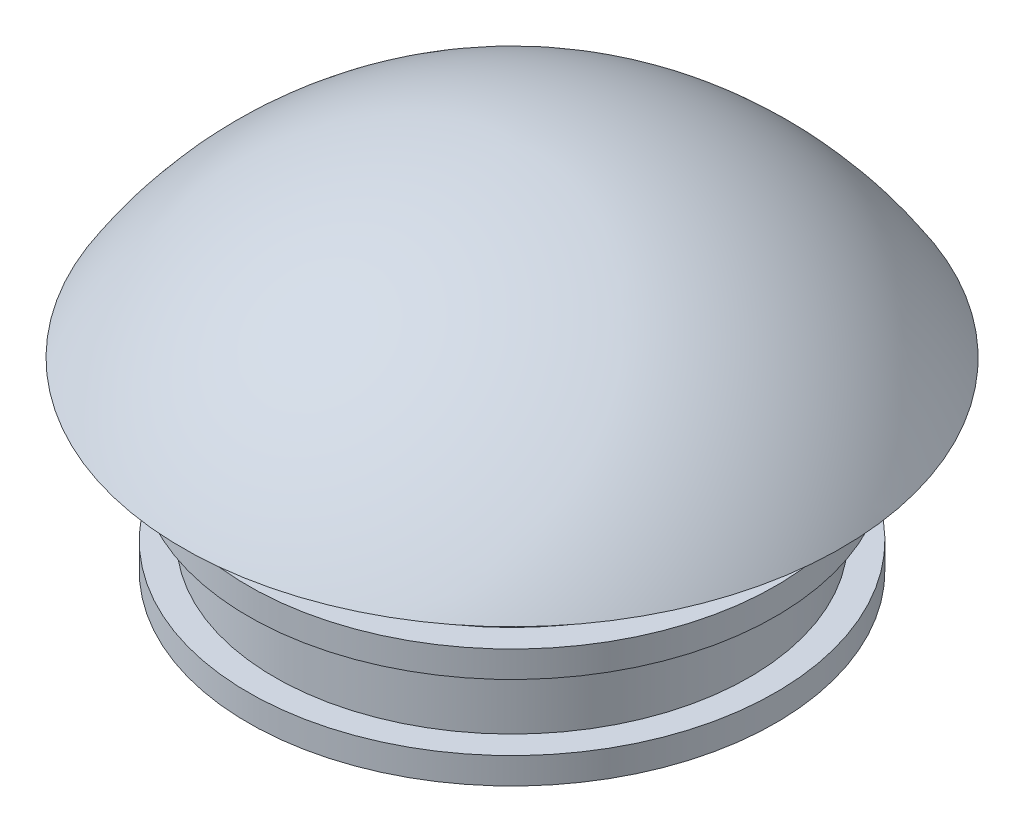
ISO-10303-21;
HEADER;
FILE_DESCRIPTION(('STEP AP214'),'2;1');
FILE_NAME('part.step','',(''),(''),'','','');
FILE_SCHEMA(('AUTOMOTIVE_DESIGN { 1 0 10303 214 1 1 1 1 }'));
ENDSEC;
DATA;
#1=APPLICATION_CONTEXT('core data for automotive mechanical design processes');
#2=APPLICATION_PROTOCOL_DEFINITION('international standard','automotive_design',2000,#1);
#3=PRODUCT_CONTEXT('',#1,'mechanical');
#4=PRODUCT('Part','Part','',(#3));
#5=PRODUCT_RELATED_PRODUCT_CATEGORY('part','',(#4));
#6=PRODUCT_DEFINITION_FORMATION('','',#4);
#7=PRODUCT_DEFINITION_CONTEXT('part definition',#1,'design');
#8=PRODUCT_DEFINITION('design','',#6,#7);
#9=PRODUCT_DEFINITION_SHAPE('','',#8);
#10=(LENGTH_UNIT() NAMED_UNIT(*) SI_UNIT(.MILLI.,.METRE.));
#11=(NAMED_UNIT(*) PLANE_ANGLE_UNIT() SI_UNIT($,.RADIAN.));
#12=(NAMED_UNIT(*) SI_UNIT($,.STERADIAN.) SOLID_ANGLE_UNIT());
#13=UNCERTAINTY_MEASURE_WITH_UNIT(LENGTH_MEASURE(1.E-05),#10,'distance_accuracy_value','');
#14=(GEOMETRIC_REPRESENTATION_CONTEXT(3) GLOBAL_UNCERTAINTY_ASSIGNED_CONTEXT((#13)) GLOBAL_UNIT_ASSIGNED_CONTEXT((#10,
#11,#12)) REPRESENTATION_CONTEXT('',''));
#15=CARTESIAN_POINT('',(0.,0.,0.));
#16=DIRECTION('',(0.,0.,1.));
#17=DIRECTION('',(1.,0.,0.));
#18=AXIS2_PLACEMENT_3D('',#15,#16,#17);
#19=CARTESIAN_POINT('',(-8.,4.,0.));
#20=DIRECTION('',(0.,1.,0.));
#21=DIRECTION('',(0.,0.,1.));
#22=AXIS2_PLACEMENT_3D('',#19,#20,#21);
#23=PLANE('',#22);
#24=CARTESIAN_POINT('',(0.,4.,0.));
#25=DIRECTION('',(0.,-1.,0.));
#26=DIRECTION('',(0.,0.,-1.));
#27=AXIS2_PLACEMENT_3D('',#24,#25,#26);
#28=CIRCLE('',#27,8.);
#29=CARTESIAN_POINT('',(0.,4.,-8.));
#30=VERTEX_POINT('',#29);
#31=EDGE_CURVE('E11',#30,#30,#28,.T.);
#32=ORIENTED_EDGE('',*,*,#31,.T.);
#33=EDGE_LOOP('',(#32));
#34=FACE_BOUND('',#33,.T.);
#35=ADVANCED_FACE('F34',(#34),#23,.F.);
#36=CARTESIAN_POINT('',(0.,4.,0.));
#37=DIRECTION('',(0.,-1.,0.));
#38=DIRECTION('',(0.,0.,-1.));
#39=AXIS2_PLACEMENT_3D('',#36,#37,#38);
#40=CYLINDRICAL_SURFACE('',#39,8.);
#41=ORIENTED_EDGE('',*,*,#31,.F.);
#42=EDGE_LOOP('',(#41));
#43=FACE_BOUND('',#42,.T.);
#44=CARTESIAN_POINT('',(0.,-3.,0.));
#45=DIRECTION('',(0.,-1.,0.));
#46=DIRECTION('',(0.,0.,-1.));
#47=AXIS2_PLACEMENT_3D('',#44,#45,#46);
#48=CIRCLE('',#47,8.);
#49=CARTESIAN_POINT('',(0.,-3.,-8.));
#50=VERTEX_POINT('',#49);
#51=EDGE_CURVE('E40',#50,#50,#48,.T.);
#52=ORIENTED_EDGE('',*,*,#51,.T.);
#53=EDGE_LOOP('',(#52));
#54=FACE_BOUND('',#53,.T.);
#55=ADVANCED_FACE('F56',(#43,#54),#40,.F.);
#56=CARTESIAN_POINT('',(-8.,-3.,0.));
#57=DIRECTION('',(0.,1.,0.));
#58=DIRECTION('',(0.,0.,1.));
#59=AXIS2_PLACEMENT_3D('',#56,#57,#58);
#60=PLANE('',#59);
#61=ORIENTED_EDGE('',*,*,#51,.F.);
#62=EDGE_LOOP('',(#61));
#63=FACE_BOUND('',#62,.T.);
#64=CARTESIAN_POINT('',(0.,-3.,0.));
#65=DIRECTION('',(0.,-1.,0.));
#66=DIRECTION('',(0.,0.,-1.));
#67=AXIS2_PLACEMENT_3D('',#64,#65,#66);
#68=CIRCLE('',#67,10.);
#69=CARTESIAN_POINT('',(0.,-3.,-10.));
#70=VERTEX_POINT('',#69);
#71=EDGE_CURVE('E68',#70,#70,#68,.T.);
#72=ORIENTED_EDGE('',*,*,#71,.T.);
#73=EDGE_LOOP('',(#72));
#74=FACE_BOUND('',#73,.T.);
#75=ADVANCED_FACE('F61',(#63,#74),#60,.F.);
#76=CARTESIAN_POINT('',(0.,4.,0.));
#77=DIRECTION('',(0.,-1.,0.));
#78=DIRECTION('',(0.,0.,-1.));
#79=AXIS2_PLACEMENT_3D('',#76,#77,#78);
#80=CYLINDRICAL_SURFACE('',#79,10.);
#81=ORIENTED_EDGE('',*,*,#71,.F.);
#82=EDGE_LOOP('',(#81));
#83=FACE_BOUND('',#82,.T.);
#84=CARTESIAN_POINT('',(0.,-2.,0.));
#85=DIRECTION('',(0.,-1.,0.));
#86=DIRECTION('',(0.,0.,-1.));
#87=AXIS2_PLACEMENT_3D('',#84,#85,#86);
#88=CIRCLE('',#87,10.);
#89=CARTESIAN_POINT('',(0.,-2.,-10.));
#90=VERTEX_POINT('',#89);
#91=EDGE_CURVE('E70',#90,#90,#88,.T.);
#92=ORIENTED_EDGE('',*,*,#91,.T.);
#93=EDGE_LOOP('',(#92));
#94=FACE_BOUND('',#93,.T.);
#95=ADVANCED_FACE('F124',(#83,#94),#80,.T.);
#96=CARTESIAN_POINT('',(-10.,-2.,0.));
#97=DIRECTION('',(0.,-1.,0.));
#98=DIRECTION('',(0.,0.,-1.));
#99=AXIS2_PLACEMENT_3D('',#96,#97,#98);
#100=PLANE('',#99);
#101=ORIENTED_EDGE('',*,*,#91,.F.);
#102=EDGE_LOOP('',(#101));
#103=FACE_BOUND('',#102,.T.);
#104=CARTESIAN_POINT('',(0.,-2.,0.));
#105=DIRECTION('',(0.,-1.,0.));
#106=DIRECTION('',(0.,0.,-1.));
#107=AXIS2_PLACEMENT_3D('',#104,#105,#106);
#108=CIRCLE('',#107,9.);
#109=CARTESIAN_POINT('',(0.,-2.,-9.));
#110=VERTEX_POINT('',#109);
#111=EDGE_CURVE('E75',#110,#110,#108,.T.);
#112=ORIENTED_EDGE('',*,*,#111,.T.);
#113=EDGE_LOOP('',(#112));
#114=FACE_BOUND('',#113,.T.);
#115=ADVANCED_FACE('F120',(#103,#114),#100,.F.);
#116=CARTESIAN_POINT('',(0.,4.,0.));
#117=DIRECTION('',(0.,-1.,0.));
#118=DIRECTION('',(0.,0.,-1.));
#119=AXIS2_PLACEMENT_3D('',#116,#117,#118);
#120=CYLINDRICAL_SURFACE('',#119,9.);
#121=ORIENTED_EDGE('',*,*,#111,.F.);
#122=EDGE_LOOP('',(#121));
#123=FACE_BOUND('',#122,.T.);
#124=CARTESIAN_POINT('',(0.,0.499999999999997,0.));
#125=DIRECTION('',(0.,-1.,0.));
#126=DIRECTION('',(0.,0.,-1.));
#127=AXIS2_PLACEMENT_3D('',#124,#125,#126);
#128=CIRCLE('',#127,9.);
#129=CARTESIAN_POINT('',(0.,0.499999999999997,-9.));
#130=VERTEX_POINT('',#129);
#131=EDGE_CURVE('E78',#130,#130,#128,.T.);
#132=ORIENTED_EDGE('',*,*,#131,.T.);
#133=EDGE_LOOP('',(#132));
#134=FACE_BOUND('',#133,.T.);
#135=ADVANCED_FACE('F116',(#123,#134),#120,.T.);
#136=CARTESIAN_POINT('',(-10.,0.499999999999997,0.));
#137=DIRECTION('',(0.,1.,0.));
#138=DIRECTION('',(0.,0.,1.));
#139=AXIS2_PLACEMENT_3D('',#136,#137,#138);
#140=PLANE('',#139);
#141=ORIENTED_EDGE('',*,*,#131,.F.);
#142=EDGE_LOOP('',(#141));
#143=FACE_BOUND('',#142,.T.);
#144=CARTESIAN_POINT('',(0.,0.499999999999997,0.));
#145=DIRECTION('',(0.,-1.,0.));
#146=DIRECTION('',(0.,0.,-1.));
#147=AXIS2_PLACEMENT_3D('',#144,#145,#146);
#148=CIRCLE('',#147,10.);
#149=CARTESIAN_POINT('',(0.,0.499999999999997,-10.));
#150=VERTEX_POINT('',#149);
#151=EDGE_CURVE('E81',#150,#150,#148,.T.);
#152=ORIENTED_EDGE('',*,*,#151,.T.);
#153=EDGE_LOOP('',(#152));
#154=FACE_BOUND('',#153,.T.);
#155=ADVANCED_FACE('F112',(#143,#154),#140,.F.);
#156=CARTESIAN_POINT('',(0.,4.,0.));
#157=DIRECTION('',(0.,-1.,0.));
#158=DIRECTION('',(0.,0.,-1.));
#159=AXIS2_PLACEMENT_3D('',#156,#157,#158);
#160=CYLINDRICAL_SURFACE('',#159,10.);
#161=ORIENTED_EDGE('',*,*,#151,.F.);
#162=EDGE_LOOP('',(#161));
#163=FACE_BOUND('',#162,.T.);
#164=CARTESIAN_POINT('',(0.,1.5,0.));
#165=DIRECTION('',(0.,-1.,0.));
#166=DIRECTION('',(0.,0.,-1.));
#167=AXIS2_PLACEMENT_3D('',#164,#165,#166);
#168=CIRCLE('',#167,10.);
#169=CARTESIAN_POINT('',(0.,1.5,-10.));
#170=VERTEX_POINT('',#169);
#171=EDGE_CURVE('E84',#170,#170,#168,.T.);
#172=ORIENTED_EDGE('',*,*,#171,.T.);
#173=EDGE_LOOP('',(#172));
#174=FACE_BOUND('',#173,.T.);
#175=ADVANCED_FACE('F105',(#163,#174),#160,.T.);
#176=CARTESIAN_POINT('',(-9.,1.5,0.));
#177=DIRECTION('',(0.,-1.,0.));
#178=DIRECTION('',(0.,0.,-1.));
#179=AXIS2_PLACEMENT_3D('',#176,#177,#178);
#180=PLANE('',#179);
#181=ORIENTED_EDGE('',*,*,#171,.F.);
#182=EDGE_LOOP('',(#181));
#183=FACE_BOUND('',#182,.T.);
#184=CARTESIAN_POINT('',(0.,1.5,0.));
#185=DIRECTION('',(0.,-1.,0.));
#186=DIRECTION('',(0.,0.,-1.));
#187=AXIS2_PLACEMENT_3D('',#184,#185,#186);
#188=CIRCLE('',#187,9.);
#189=CARTESIAN_POINT('',(0.,1.5,-9.));
#190=VERTEX_POINT('',#189);
#191=EDGE_CURVE('E87',#190,#190,#188,.T.);
#192=ORIENTED_EDGE('',*,*,#191,.T.);
#193=EDGE_LOOP('',(#192));
#194=FACE_BOUND('',#193,.T.);
#195=ADVANCED_FACE('F99',(#183,#194),#180,.F.);
#196=CARTESIAN_POINT('',(0.,4.,0.));
#197=DIRECTION('',(0.,-1.,0.));
#198=DIRECTION('',(0.,0.,-1.));
#199=AXIS2_PLACEMENT_3D('',#196,#197,#198);
#200=CYLINDRICAL_SURFACE('',#199,9.);
#201=ORIENTED_EDGE('',*,*,#191,.F.);
#202=EDGE_LOOP('',(#201));
#203=FACE_BOUND('',#202,.T.);
#204=CARTESIAN_POINT('',(0.,4.,0.));
#205=DIRECTION('',(0.,-1.,0.));
#206=DIRECTION('',(0.,0.,-1.));
#207=AXIS2_PLACEMENT_3D('',#204,#205,#206);
#208=CIRCLE('',#207,9.);
#209=CARTESIAN_POINT('',(0.,4.,-9.));
#210=VERTEX_POINT('',#209);
#211=EDGE_CURVE('E90',#210,#210,#208,.T.);
#212=ORIENTED_EDGE('',*,*,#211,.T.);
#213=EDGE_LOOP('',(#212));
#214=FACE_BOUND('',#213,.T.);
#215=ADVANCED_FACE('F51',(#203,#214),#200,.T.);
#216=CARTESIAN_POINT('',(-9.,4.,0.));
#217=DIRECTION('',(0.,1.,0.));
#218=DIRECTION('',(0.,0.,1.));
#219=AXIS2_PLACEMENT_3D('',#216,#217,#218);
#220=PLANE('',#219);
#221=ORIENTED_EDGE('',*,*,#211,.F.);
#222=EDGE_LOOP('',(#221));
#223=FACE_BOUND('',#222,.T.);
#224=CARTESIAN_POINT('',(0.,4.,0.));
#225=DIRECTION('',(0.,-1.,0.));
#226=DIRECTION('',(0.,0.,-1.));
#227=AXIS2_PLACEMENT_3D('',#224,#225,#226);
#228=CIRCLE('',#227,12.5);
#229=CARTESIAN_POINT('',(0.,4.,-12.5));
#230=VERTEX_POINT('',#229);
#231=EDGE_CURVE('E93',#230,#230,#228,.T.);
#232=ORIENTED_EDGE('',*,*,#231,.T.);
#233=EDGE_LOOP('',(#232));
#234=FACE_BOUND('',#233,.T.);
#235=ADVANCED_FACE('F45',(#223,#234),#220,.F.);
#236=CARTESIAN_POINT('',(0.,-3.99880508011167,0.189330844862531));
#237=DIRECTION('',(-1.,0.,0.));
#238=DIRECTION('',(0.,0.,-1.));
#239=AXIS2_PLACEMENT_3D('',#236,#237,#238);
#240=CIRCLE('',#239,15.);
#241=TRIMMED_CURVE('',#240,(PARAMETER_VALUE(-1.5581739352968)),
(PARAMETER_VALUE(1.5581739352968)),.T.,.PARAMETER.);
#242=CARTESIAN_POINT('',(0.,-3.99880508011167,0.));
#243=DIRECTION('',(0.,-1.,0.));
#244=AXIS1_PLACEMENT('',#242,#243);
#245=SURFACE_OF_REVOLUTION('',#241,#244);
#246=ORIENTED_EDGE('',*,*,#231,.F.);
#247=EDGE_LOOP('',(#246));
#248=FACE_BOUND('',#247,.T.);
#249=CARTESIAN_POINT('',(0.,11.,0.));
#250=VERTEX_POINT('',#249);
#251=VERTEX_LOOP('',#250);
#252=FACE_BOUND('',#251,.T.);
#253=ADVANCED_FACE('F43',(#248,#252),#245,.T.);
#254=CLOSED_SHELL('',(#35,#55,#75,#95,#115,#135,#155,#175,#195,#215,#235,#253));
#255=MANIFOLD_SOLID_BREP('B2',#254);
#256=ADVANCED_BREP_SHAPE_REPRESENTATION('',(#18,#255),#14);
#257=SHAPE_DEFINITION_REPRESENTATION(#9,#256);
ENDSEC;
END-ISO-10303-21;
